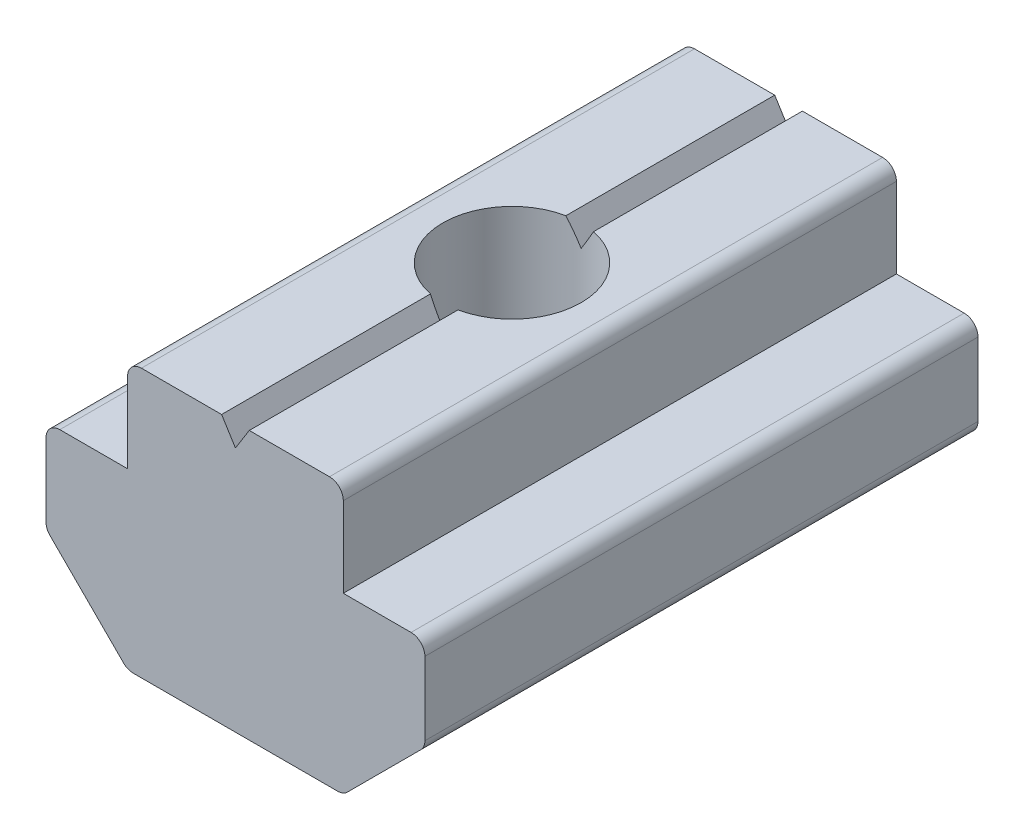
ISO-10303-21;
HEADER;
FILE_DESCRIPTION(('STEP AP214'),'2;1');
FILE_NAME('part.step','',(''),(''),'','','');
FILE_SCHEMA(('AUTOMOTIVE_DESIGN { 1 0 10303 214 1 1 1 1 }'));
ENDSEC;
DATA;
#1=APPLICATION_CONTEXT('core data for automotive mechanical design processes');
#2=APPLICATION_PROTOCOL_DEFINITION('international standard','automotive_design',2000,#1);
#3=PRODUCT_CONTEXT('',#1,'mechanical');
#4=PRODUCT('Part','Part','',(#3));
#5=PRODUCT_RELATED_PRODUCT_CATEGORY('part','',(#4));
#6=PRODUCT_DEFINITION_FORMATION('','',#4);
#7=PRODUCT_DEFINITION_CONTEXT('part definition',#1,'design');
#8=PRODUCT_DEFINITION('design','',#6,#7);
#9=PRODUCT_DEFINITION_SHAPE('','',#8);
#10=(LENGTH_UNIT() NAMED_UNIT(*) SI_UNIT(.MILLI.,.METRE.));
#11=(NAMED_UNIT(*) PLANE_ANGLE_UNIT() SI_UNIT($,.RADIAN.));
#12=(NAMED_UNIT(*) SI_UNIT($,.STERADIAN.) SOLID_ANGLE_UNIT());
#13=UNCERTAINTY_MEASURE_WITH_UNIT(LENGTH_MEASURE(1.E-05),#10,'distance_accuracy_value','');
#14=(GEOMETRIC_REPRESENTATION_CONTEXT(3) GLOBAL_UNCERTAINTY_ASSIGNED_CONTEXT((#13)) GLOBAL_UNIT_ASSIGNED_CONTEXT((#10,
#11,#12)) REPRESENTATION_CONTEXT('',''));
#15=CARTESIAN_POINT('',(0.,0.,0.));
#16=DIRECTION('',(0.,0.,1.));
#17=DIRECTION('',(1.,0.,0.));
#18=AXIS2_PLACEMENT_3D('',#15,#16,#17);
#19=CARTESIAN_POINT('',(3.88423493499598,8.9000000000002,10.));
#20=DIRECTION('',(0.847998304005041,-0.529998940003256,0.));
#21=DIRECTION('',(0.529998940003256,0.847998304005041,0.));
#22=AXIS2_PLACEMENT_3D('',#19,#20,#21);
#23=PLANE('',#22);
#24=DIRECTION('',(0.,0.,-1.));
#25=VECTOR('',#24,1.);
#26=CARTESIAN_POINT('',(3.88423493499598,8.9000000000002,10.));
#27=LINE('',#26,#25);
#28=CARTESIAN_POINT('',(3.88423493499598,8.9000000000002,-2.49999999999999));
#29=VERTEX_POINT('',#28);
#30=CARTESIAN_POINT('',(3.88423493499598,8.9000000000002,-10.));
#31=VERTEX_POINT('',#30);
#32=EDGE_CURVE('E288',#29,#31,#27,.T.);
#33=ORIENTED_EDGE('',*,*,#32,.F.);
#34=CARTESIAN_POINT('',(3.88423493499598,8.9000000000002,0.));
#35=DIRECTION('',(0.847998304005041,-0.529998940003256,0.));
#36=DIRECTION('',(-0.529998940003256,-0.847998304005041,0.));
#37=AXIS2_PLACEMENT_3D('',#34,#35,#36);
#38=ELLIPSE('',#37,4.71699056602762,2.5);
#39=CARTESIAN_POINT('',(4.38423493499598,9.70000000000005,-2.44948974278317));
#40=VERTEX_POINT('',#39);
#41=EDGE_CURVE('E389',#29,#40,#38,.T.);
#42=ORIENTED_EDGE('',*,*,#41,.T.);
#43=DIRECTION('',(0.,0.,-1.));
#44=VECTOR('',#43,1.);
#45=CARTESIAN_POINT('',(4.38423493499598,9.70000000000005,10.));
#46=LINE('',#45,#44);
#47=CARTESIAN_POINT('',(4.38423493499598,9.70000000000005,-10.));
#48=VERTEX_POINT('',#47);
#49=EDGE_CURVE('E292',#40,#48,#46,.T.);
#50=ORIENTED_EDGE('',*,*,#49,.T.);
#51=DIRECTION('',(-0.529998940003256,-0.847998304005041,0.));
#52=VECTOR('',#51,1.);
#53=CARTESIAN_POINT('',(3.88423493499598,8.9000000000002,-10.));
#54=LINE('',#53,#52);
#55=EDGE_CURVE('E248',#48,#31,#54,.T.);
#56=ORIENTED_EDGE('',*,*,#55,.T.);
#57=EDGE_LOOP('',(#33,#42,#50,#56));
#58=FACE_BOUND('',#57,.T.);
#59=ADVANCED_FACE('F37',(#58),#23,.F.);
#60=CARTESIAN_POINT('',(3.88423493499598,8.9000000000002,10.));
#61=DIRECTION('',(-0.84799830400504,-0.529998940003256,0.));
#62=DIRECTION('',(0.529998940003256,-0.84799830400504,0.));
#63=AXIS2_PLACEMENT_3D('',#60,#61,#62);
#64=PLANE('',#63);
#65=CARTESIAN_POINT('',(3.88423493499598,8.9000000000002,10.));
#66=VERTEX_POINT('',#65);
#67=CARTESIAN_POINT('',(3.88423493499598,8.9000000000002,2.5));
#68=VERTEX_POINT('',#67);
#69=EDGE_CURVE('E289',#66,#68,#27,.T.);
#70=ORIENTED_EDGE('',*,*,#69,.T.);
#71=CARTESIAN_POINT('',(3.88423493499598,8.90000000000021,0.));
#72=DIRECTION('',(-0.84799830400504,-0.529998940003256,0.));
#73=DIRECTION('',(0.529998940003256,-0.847998304005041,0.));
#74=AXIS2_PLACEMENT_3D('',#71,#72,#73);
#75=ELLIPSE('',#74,4.71699056602762,2.5);
#76=CARTESIAN_POINT('',(3.38423493499598,9.70000000000005,2.44948974278317));
#77=VERTEX_POINT('',#76);
#78=EDGE_CURVE('E393',#68,#77,#75,.T.);
#79=ORIENTED_EDGE('',*,*,#78,.T.);
#80=DIRECTION('',(0.,0.,-1.));
#81=VECTOR('',#80,1.);
#82=CARTESIAN_POINT('',(3.38423493499598,9.70000000000005,10.));
#83=LINE('',#82,#81);
#84=CARTESIAN_POINT('',(3.38423493499598,9.70000000000005,10.));
#85=VERTEX_POINT('',#84);
#86=EDGE_CURVE('E285',#85,#77,#83,.T.);
#87=ORIENTED_EDGE('',*,*,#86,.F.);
#88=DIRECTION('',(-0.529998940003256,0.84799830400504,0.));
#89=VECTOR('',#88,1.);
#90=CARTESIAN_POINT('',(3.88423493499598,8.9000000000002,10.));
#91=LINE('',#90,#89);
#92=EDGE_CURVE('E361',#66,#85,#91,.T.);
#93=ORIENTED_EDGE('',*,*,#92,.F.);
#94=EDGE_LOOP('',(#70,#79,#87,#93));
#95=FACE_BOUND('',#94,.T.);
#96=ADVANCED_FACE('F410',(#95),#64,.F.);
#97=CARTESIAN_POINT('',(0.19134171618256,0.500000000000114,10.));
#98=DIRECTION('',(0.,0.,-1.));
#99=DIRECTION('',(-1.,0.,0.));
#100=AXIS2_PLACEMENT_3D('',#97,#98,#99);
#101=CYLINDRICAL_SURFACE('',#100,0.50000000000014);
#102=CARTESIAN_POINT('',(0.19134171618256,0.500000000000114,-10.));
#103=DIRECTION('',(0.,0.,1.));
#104=DIRECTION('',(1.,0.,0.));
#105=AXIS2_PLACEMENT_3D('',#102,#103,#104);
#106=CIRCLE('',#105,0.50000000000014);
#107=CARTESIAN_POINT('',(-0.162211674410773,0.146446609406666,-10.));
#108=VERTEX_POINT('',#107);
#109=CARTESIAN_POINT('',(0.19134171618256,0.,-10.));
#110=VERTEX_POINT('',#109);
#111=EDGE_CURVE('E223',#108,#110,#106,.T.);
#112=ORIENTED_EDGE('',*,*,#111,.T.);
#113=DIRECTION('',(0.,0.,-1.));
#114=VECTOR('',#113,1.);
#115=CARTESIAN_POINT('',(0.19134171618256,0.,10.));
#116=LINE('',#115,#114);
#117=CARTESIAN_POINT('',(0.19134171618256,0.,10.));
#118=VERTEX_POINT('',#117);
#119=EDGE_CURVE('E11',#118,#110,#116,.T.);
#120=ORIENTED_EDGE('',*,*,#119,.F.);
#121=CARTESIAN_POINT('',(0.19134171618256,0.500000000000114,10.));
#122=DIRECTION('',(0.,0.,1.));
#123=DIRECTION('',(1.,0.,0.));
#124=AXIS2_PLACEMENT_3D('',#121,#122,#123);
#125=CIRCLE('',#124,0.50000000000014);
#126=CARTESIAN_POINT('',(-0.162211674410773,0.146446609406666,10.));
#127=VERTEX_POINT('',#126);
#128=EDGE_CURVE('E268',#127,#118,#125,.T.);
#129=ORIENTED_EDGE('',*,*,#128,.F.);
#130=DIRECTION('',(0.,0.,-1.));
#131=VECTOR('',#130,1.);
#132=CARTESIAN_POINT('',(-0.162211674410773,0.146446609406666,10.));
#133=LINE('',#132,#131);
#134=EDGE_CURVE('E219',#127,#108,#133,.T.);
#135=ORIENTED_EDGE('',*,*,#134,.T.);
#136=EDGE_LOOP('',(#112,#120,#129,#135));
#137=FACE_BOUND('',#136,.T.);
#138=ADVANCED_FACE('F39',(#137),#101,.T.);
#139=CARTESIAN_POINT('',(7.57712815380941,0.,10.));
#140=DIRECTION('',(0.,1.,0.));
#141=DIRECTION('',(-1.,0.,0.));
#142=AXIS2_PLACEMENT_3D('',#139,#140,#141);
#143=PLANE('',#142);
#144=CARTESIAN_POINT('',(3.88423493499598,0.,0.));
#145=DIRECTION('',(0.,-1.,0.));
#146=DIRECTION('',(0.,0.,-1.));
#147=AXIS2_PLACEMENT_3D('',#144,#145,#146);
#148=CIRCLE('',#147,2.5);
#149=CARTESIAN_POINT('',(3.88423493499598,0.,-2.5));
#150=VERTEX_POINT('',#149);
#151=EDGE_CURVE('E397',#150,#150,#148,.T.);
#152=ORIENTED_EDGE('',*,*,#151,.F.);
#153=EDGE_LOOP('',(#152));
#154=FACE_BOUND('',#153,.T.);
#155=DIRECTION('',(1.,0.,0.));
#156=VECTOR('',#155,1.);
#157=CARTESIAN_POINT('',(7.57712815380941,0.,-10.));
#158=LINE('',#157,#156);
#159=CARTESIAN_POINT('',(7.57712815380941,0.,-10.));
#160=VERTEX_POINT('',#159);
#161=EDGE_CURVE('E226',#110,#160,#158,.T.);
#162=ORIENTED_EDGE('',*,*,#161,.T.);
#163=DIRECTION('',(0.,0.,-1.));
#164=VECTOR('',#163,1.);
#165=CARTESIAN_POINT('',(7.57712815380941,0.,10.));
#166=LINE('',#165,#164);
#167=CARTESIAN_POINT('',(7.57712815380941,0.,10.));
#168=VERTEX_POINT('',#167);
#169=EDGE_CURVE('E45',#168,#160,#166,.T.);
#170=ORIENTED_EDGE('',*,*,#169,.F.);
#171=DIRECTION('',(1.,0.,0.));
#172=VECTOR('',#171,1.);
#173=CARTESIAN_POINT('',(7.57712815380941,0.,10.));
#174=LINE('',#173,#172);
#175=EDGE_CURVE('E141',#118,#168,#174,.T.);
#176=ORIENTED_EDGE('',*,*,#175,.F.);
#177=ORIENTED_EDGE('',*,*,#119,.T.);
#178=EDGE_LOOP('',(#162,#170,#176,#177));
#179=FACE_BOUND('',#178,.T.);
#180=ADVANCED_FACE('F403',(#154,#179),#143,.F.);
#181=CARTESIAN_POINT('',(7.57712815380941,0.500000000000228,10.));
#182=DIRECTION('',(0.,0.,-1.));
#183=DIRECTION('',(-1.,0.,0.));
#184=AXIS2_PLACEMENT_3D('',#181,#182,#183);
#185=CYLINDRICAL_SURFACE('',#184,0.500000000000165);
#186=CARTESIAN_POINT('',(7.57712815380941,0.500000000000228,-10.));
#187=DIRECTION('',(0.,0.,1.));
#188=DIRECTION('',(1.,0.,0.));
#189=AXIS2_PLACEMENT_3D('',#186,#187,#188);
#190=CIRCLE('',#189,0.500000000000165);
#191=CARTESIAN_POINT('',(7.93068154440274,0.14644660940678,-10.));
#192=VERTEX_POINT('',#191);
#193=EDGE_CURVE('E229',#160,#192,#190,.T.);
#194=ORIENTED_EDGE('',*,*,#193,.T.);
#195=DIRECTION('',(0.,0.,-1.));
#196=VECTOR('',#195,1.);
#197=CARTESIAN_POINT('',(7.93068154440274,0.14644660940678,10.));
#198=LINE('',#197,#196);
#199=CARTESIAN_POINT('',(7.93068154440274,0.14644660940678,10.));
#200=VERTEX_POINT('',#199);
#201=EDGE_CURVE('E317',#200,#192,#198,.T.);
#202=ORIENTED_EDGE('',*,*,#201,.F.);
#203=CARTESIAN_POINT('',(7.57712815380941,0.500000000000228,10.));
#204=DIRECTION('',(0.,0.,1.));
#205=DIRECTION('',(1.,0.,0.));
#206=AXIS2_PLACEMENT_3D('',#203,#204,#205);
#207=CIRCLE('',#206,0.500000000000165);
#208=EDGE_CURVE('E325',#168,#200,#207,.T.);
#209=ORIENTED_EDGE('',*,*,#208,.F.);
#210=ORIENTED_EDGE('',*,*,#169,.T.);
#211=EDGE_LOOP('',(#194,#202,#209,#210));
#212=FACE_BOUND('',#211,.T.);
#213=ADVANCED_FACE('F323',(#212),#185,.T.);
#214=CARTESIAN_POINT('',(10.5877883255897,2.8035533905935,10.));
#215=DIRECTION('',(-0.707106781186518,0.707106781186577,0.));
#216=DIRECTION('',(-0.707106781186577,-0.707106781186518,0.));
#217=AXIS2_PLACEMENT_3D('',#214,#215,#216);
#218=PLANE('',#217);
#219=DIRECTION('',(0.707106781186577,0.707106781186518,0.));
#220=VECTOR('',#219,1.);
#221=CARTESIAN_POINT('',(10.5877883255897,2.8035533905935,-10.));
#222=LINE('',#221,#220);
#223=CARTESIAN_POINT('',(10.5877883255897,2.8035533905935,-10.));
#224=VERTEX_POINT('',#223);
#225=EDGE_CURVE('E231',#192,#224,#222,.T.);
#226=ORIENTED_EDGE('',*,*,#225,.T.);
#227=DIRECTION('',(0.,0.,-1.));
#228=VECTOR('',#227,1.);
#229=CARTESIAN_POINT('',(10.5877883255897,2.8035533905935,10.));
#230=LINE('',#229,#228);
#231=CARTESIAN_POINT('',(10.5877883255897,2.8035533905935,10.));
#232=VERTEX_POINT('',#231);
#233=EDGE_CURVE('E314',#232,#224,#230,.T.);
#234=ORIENTED_EDGE('',*,*,#233,.F.);
#235=DIRECTION('',(0.707106781186577,0.707106781186518,0.));
#236=VECTOR('',#235,1.);
#237=CARTESIAN_POINT('',(10.5877883255897,2.8035533905935,10.));
#238=LINE('',#237,#236);
#239=EDGE_CURVE('E343',#200,#232,#238,.T.);
#240=ORIENTED_EDGE('',*,*,#239,.F.);
#241=ORIENTED_EDGE('',*,*,#201,.T.);
#242=EDGE_LOOP('',(#226,#234,#240,#241));
#243=FACE_BOUND('',#242,.T.);
#244=ADVANCED_FACE('F334',(#243),#218,.F.);
#245=CARTESIAN_POINT('',(10.2342349349963,3.15710678118671,10.));
#246=DIRECTION('',(0.,0.,-1.));
#247=DIRECTION('',(-1.,0.,0.));
#248=AXIS2_PLACEMENT_3D('',#245,#246,#247);
#249=CYLINDRICAL_SURFACE('',#248,0.5);
#250=CARTESIAN_POINT('',(10.2342349349963,3.15710678118671,-10.));
#251=DIRECTION('',(0.,0.,1.));
#252=DIRECTION('',(1.,0.,0.));
#253=AXIS2_PLACEMENT_3D('',#250,#251,#252);
#254=CIRCLE('',#253,0.5);
#255=CARTESIAN_POINT('',(10.7342349349963,3.15710678118671,-10.));
#256=VERTEX_POINT('',#255);
#257=EDGE_CURVE('E233',#224,#256,#254,.T.);
#258=ORIENTED_EDGE('',*,*,#257,.T.);
#259=DIRECTION('',(0.,0.,-1.));
#260=VECTOR('',#259,1.);
#261=CARTESIAN_POINT('',(10.7342349349963,3.15710678118671,10.));
#262=LINE('',#261,#260);
#263=CARTESIAN_POINT('',(10.7342349349963,3.15710678118671,10.));
#264=VERTEX_POINT('',#263);
#265=EDGE_CURVE('E311',#264,#256,#262,.T.);
#266=ORIENTED_EDGE('',*,*,#265,.F.);
#267=CARTESIAN_POINT('',(10.2342349349963,3.15710678118671,10.));
#268=DIRECTION('',(0.,0.,1.));
#269=DIRECTION('',(1.,0.,0.));
#270=AXIS2_PLACEMENT_3D('',#267,#268,#269);
#271=CIRCLE('',#270,0.5);
#272=EDGE_CURVE('E340',#232,#264,#271,.T.);
#273=ORIENTED_EDGE('',*,*,#272,.F.);
#274=ORIENTED_EDGE('',*,*,#233,.T.);
#275=EDGE_LOOP('',(#258,#266,#273,#274));
#276=FACE_BOUND('',#275,.T.);
#277=ADVANCED_FACE('F338',(#276),#249,.T.);
#278=CARTESIAN_POINT('',(10.7342349349959,5.8000000000003,10.));
#279=DIRECTION('',(-1.,-1.71969698764429E-13,0.));
#280=DIRECTION('',(1.71969698764429E-13,-1.,0.));
#281=AXIS2_PLACEMENT_3D('',#278,#279,#280);
#282=PLANE('',#281);
#283=DIRECTION('',(-1.71969698764429E-13,1.,0.));
#284=VECTOR('',#283,1.);
#285=CARTESIAN_POINT('',(10.7342349349959,5.8000000000003,-10.));
#286=LINE('',#285,#284);
#287=CARTESIAN_POINT('',(10.7342349349959,5.8000000000003,-10.));
#288=VERTEX_POINT('',#287);
#289=EDGE_CURVE('E235',#256,#288,#286,.T.);
#290=ORIENTED_EDGE('',*,*,#289,.T.);
#291=DIRECTION('',(0.,0.,-1.));
#292=VECTOR('',#291,1.);
#293=CARTESIAN_POINT('',(10.7342349349959,5.8000000000003,10.));
#294=LINE('',#293,#292);
#295=CARTESIAN_POINT('',(10.7342349349959,5.8000000000003,10.));
#296=VERTEX_POINT('',#295);
#297=EDGE_CURVE('E308',#296,#288,#294,.T.);
#298=ORIENTED_EDGE('',*,*,#297,.F.);
#299=DIRECTION('',(-1.71969698764429E-13,1.,0.));
#300=VECTOR('',#299,1.);
#301=CARTESIAN_POINT('',(10.7342349349959,5.8000000000003,10.));
#302=LINE('',#301,#300);
#303=EDGE_CURVE('E342',#264,#296,#302,.T.);
#304=ORIENTED_EDGE('',*,*,#303,.F.);
#305=ORIENTED_EDGE('',*,*,#265,.T.);
#306=EDGE_LOOP('',(#290,#298,#304,#305));
#307=FACE_BOUND('',#306,.T.);
#308=ADVANCED_FACE('F618',(#307),#282,.F.);
#309=CARTESIAN_POINT('',(10.2342349349959,5.8000000000003,10.));
#310=DIRECTION('',(0.,0.,-1.));
#311=DIRECTION('',(-1.,0.,0.));
#312=AXIS2_PLACEMENT_3D('',#309,#310,#311);
#313=CYLINDRICAL_SURFACE('',#312,0.5);
#314=CARTESIAN_POINT('',(10.2342349349959,5.8000000000003,-10.));
#315=DIRECTION('',(0.,0.,1.));
#316=DIRECTION('',(1.,0.,0.));
#317=AXIS2_PLACEMENT_3D('',#314,#315,#316);
#318=CIRCLE('',#317,0.5);
#319=CARTESIAN_POINT('',(10.2342349349959,6.3000000000003,-10.));
#320=VERTEX_POINT('',#319);
#321=EDGE_CURVE('E237',#288,#320,#318,.T.);
#322=ORIENTED_EDGE('',*,*,#321,.T.);
#323=DIRECTION('',(0.,0.,-1.));
#324=VECTOR('',#323,1.);
#325=CARTESIAN_POINT('',(10.2342349349959,6.3000000000003,10.));
#326=LINE('',#325,#324);
#327=CARTESIAN_POINT('',(10.2342349349959,6.3000000000003,10.));
#328=VERTEX_POINT('',#327);
#329=EDGE_CURVE('E305',#328,#320,#326,.T.);
#330=ORIENTED_EDGE('',*,*,#329,.F.);
#331=CARTESIAN_POINT('',(10.2342349349959,5.8000000000003,10.));
#332=DIRECTION('',(0.,0.,1.));
#333=DIRECTION('',(1.,0.,0.));
#334=AXIS2_PLACEMENT_3D('',#331,#332,#333);
#335=CIRCLE('',#334,0.5);
#336=EDGE_CURVE('E345',#296,#328,#335,.T.);
#337=ORIENTED_EDGE('',*,*,#336,.F.);
#338=ORIENTED_EDGE('',*,*,#297,.T.);
#339=EDGE_LOOP('',(#322,#330,#337,#338));
#340=FACE_BOUND('',#339,.T.);
#341=ADVANCED_FACE('F610',(#340),#313,.T.);
#342=CARTESIAN_POINT('',(7.78423493499653,6.3000000000003,10.));
#343=DIRECTION('',(0.,-1.,0.));
#344=DIRECTION('',(0.,0.,-1.));
#345=AXIS2_PLACEMENT_3D('',#342,#343,#344);
#346=PLANE('',#345);
#347=DIRECTION('',(-1.,0.,0.));
#348=VECTOR('',#347,1.);
#349=CARTESIAN_POINT('',(7.78423493499653,6.3000000000003,-10.));
#350=LINE('',#349,#348);
#351=CARTESIAN_POINT('',(7.78423493499653,6.3000000000003,-10.));
#352=VERTEX_POINT('',#351);
#353=EDGE_CURVE('E239',#320,#352,#350,.T.);
#354=ORIENTED_EDGE('',*,*,#353,.T.);
#355=DIRECTION('',(0.,0.,-1.));
#356=VECTOR('',#355,1.);
#357=CARTESIAN_POINT('',(7.78423493499653,6.3000000000003,10.));
#358=LINE('',#357,#356);
#359=CARTESIAN_POINT('',(7.78423493499653,6.3000000000003,10.));
#360=VERTEX_POINT('',#359);
#361=EDGE_CURVE('E302',#360,#352,#358,.T.);
#362=ORIENTED_EDGE('',*,*,#361,.F.);
#363=DIRECTION('',(-1.,0.,0.));
#364=VECTOR('',#363,1.);
#365=CARTESIAN_POINT('',(7.78423493499653,6.3000000000003,10.));
#366=LINE('',#365,#364);
#367=EDGE_CURVE('E351',#328,#360,#366,.T.);
#368=ORIENTED_EDGE('',*,*,#367,.F.);
#369=ORIENTED_EDGE('',*,*,#329,.T.);
#370=EDGE_LOOP('',(#354,#362,#368,#369));
#371=FACE_BOUND('',#370,.T.);
#372=ADVANCED_FACE('F602',(#371),#346,.F.);
#373=CARTESIAN_POINT('',(7.78423493499607,9.20000000000016,10.));
#374=DIRECTION('',(-1.,-1.57321473855835E-13,0.));
#375=DIRECTION('',(1.57321473855835E-13,-1.,0.));
#376=AXIS2_PLACEMENT_3D('',#373,#374,#375);
#377=PLANE('',#376);
#378=DIRECTION('',(-1.57321473855835E-13,1.,0.));
#379=VECTOR('',#378,1.);
#380=CARTESIAN_POINT('',(7.78423493499607,9.20000000000016,-10.));
#381=LINE('',#380,#379);
#382=CARTESIAN_POINT('',(7.78423493499608,9.20000000000016,-10.));
#383=VERTEX_POINT('',#382);
#384=EDGE_CURVE('E241',#352,#383,#381,.T.);
#385=ORIENTED_EDGE('',*,*,#384,.T.);
#386=DIRECTION('',(0.,0.,-1.));
#387=VECTOR('',#386,1.);
#388=CARTESIAN_POINT('',(7.78423493499608,9.20000000000016,10.));
#389=LINE('',#388,#387);
#390=CARTESIAN_POINT('',(7.78423493499608,9.20000000000016,10.));
#391=VERTEX_POINT('',#390);
#392=EDGE_CURVE('E299',#391,#383,#389,.T.);
#393=ORIENTED_EDGE('',*,*,#392,.F.);
#394=DIRECTION('',(-1.57321473855835E-13,1.,0.));
#395=VECTOR('',#394,1.);
#396=CARTESIAN_POINT('',(7.78423493499607,9.20000000000016,10.));
#397=LINE('',#396,#395);
#398=EDGE_CURVE('E353',#360,#391,#397,.T.);
#399=ORIENTED_EDGE('',*,*,#398,.F.);
#400=ORIENTED_EDGE('',*,*,#361,.T.);
#401=EDGE_LOOP('',(#385,#393,#399,#400));
#402=FACE_BOUND('',#401,.T.);
#403=ADVANCED_FACE('F598',(#402),#377,.F.);
#404=CARTESIAN_POINT('',(7.28423493499608,9.20000000000016,10.));
#405=DIRECTION('',(0.,0.,-1.));
#406=DIRECTION('',(-1.,0.,0.));
#407=AXIS2_PLACEMENT_3D('',#404,#405,#406);
#408=CYLINDRICAL_SURFACE('',#407,0.5);
#409=CARTESIAN_POINT('',(7.28423493499608,9.20000000000016,-10.));
#410=DIRECTION('',(0.,0.,1.));
#411=DIRECTION('',(1.,0.,0.));
#412=AXIS2_PLACEMENT_3D('',#409,#410,#411);
#413=CIRCLE('',#412,0.5);
#414=CARTESIAN_POINT('',(7.28423493499608,9.70000000000016,-10.));
#415=VERTEX_POINT('',#414);
#416=EDGE_CURVE('E243',#383,#415,#413,.T.);
#417=ORIENTED_EDGE('',*,*,#416,.T.);
#418=DIRECTION('',(0.,0.,-1.));
#419=VECTOR('',#418,1.);
#420=CARTESIAN_POINT('',(7.28423493499608,9.70000000000016,10.));
#421=LINE('',#420,#419);
#422=CARTESIAN_POINT('',(7.28423493499608,9.70000000000016,10.));
#423=VERTEX_POINT('',#422);
#424=EDGE_CURVE('E296',#423,#415,#421,.T.);
#425=ORIENTED_EDGE('',*,*,#424,.F.);
#426=CARTESIAN_POINT('',(7.28423493499608,9.20000000000016,10.));
#427=DIRECTION('',(0.,0.,1.));
#428=DIRECTION('',(1.,0.,0.));
#429=AXIS2_PLACEMENT_3D('',#426,#427,#428);
#430=CIRCLE('',#429,0.5);
#431=EDGE_CURVE('E355',#391,#423,#430,.T.);
#432=ORIENTED_EDGE('',*,*,#431,.F.);
#433=ORIENTED_EDGE('',*,*,#392,.T.);
#434=EDGE_LOOP('',(#417,#425,#432,#433));
#435=FACE_BOUND('',#434,.T.);
#436=ADVANCED_FACE('F432',(#435),#408,.T.);
#437=CARTESIAN_POINT('',(4.38423493499598,9.70000000000005,10.));
#438=DIRECTION('',(0.,-1.,0.));
#439=DIRECTION('',(1.,0.,0.));
#440=AXIS2_PLACEMENT_3D('',#437,#438,#439);
#441=PLANE('',#440);
#442=ORIENTED_EDGE('',*,*,#49,.F.);
#443=CARTESIAN_POINT('',(3.88423493499598,9.70000000000003,0.));
#444=DIRECTION('',(0.,-1.,0.));
#445=DIRECTION('',(1.,0.,0.));
#446=AXIS2_PLACEMENT_3D('',#443,#444,#445);
#447=CIRCLE('',#446,2.5);
#448=CARTESIAN_POINT('',(4.38423493499598,9.70000000000005,2.44948974278317));
#449=VERTEX_POINT('',#448);
#450=EDGE_CURVE('E227',#40,#449,#447,.T.);
#451=ORIENTED_EDGE('',*,*,#450,.T.);
#452=CARTESIAN_POINT('',(4.38423493499598,9.70000000000005,10.));
#453=VERTEX_POINT('',#452);
#454=EDGE_CURVE('E293',#453,#449,#46,.T.);
#455=ORIENTED_EDGE('',*,*,#454,.F.);
#456=DIRECTION('',(-1.,0.,0.));
#457=VECTOR('',#456,1.);
#458=CARTESIAN_POINT('',(4.38423493499598,9.70000000000005,10.));
#459=LINE('',#458,#457);
#460=EDGE_CURVE('E357',#423,#453,#459,.T.);
#461=ORIENTED_EDGE('',*,*,#460,.F.);
#462=ORIENTED_EDGE('',*,*,#424,.T.);
#463=DIRECTION('',(-1.,0.,0.));
#464=VECTOR('',#463,1.);
#465=CARTESIAN_POINT('',(4.38423493499598,9.70000000000005,-10.));
#466=LINE('',#465,#464);
#467=EDGE_CURVE('E245',#415,#48,#466,.T.);
#468=ORIENTED_EDGE('',*,*,#467,.T.);
#469=EDGE_LOOP('',(#442,#451,#455,#461,#462,#468));
#470=FACE_BOUND('',#469,.T.);
#471=ADVANCED_FACE('F424',(#470),#441,.F.);
#472=ORIENTED_EDGE('',*,*,#454,.T.);
#473=EDGE_CURVE('E390',#449,#68,#38,.T.);
#474=ORIENTED_EDGE('',*,*,#473,.T.);
#475=ORIENTED_EDGE('',*,*,#69,.F.);
#476=DIRECTION('',(-0.529998940003256,-0.847998304005041,0.));
#477=VECTOR('',#476,1.);
#478=CARTESIAN_POINT('',(3.88423493499598,8.9000000000002,10.));
#479=LINE('',#478,#477);
#480=EDGE_CURVE('E359',#453,#66,#479,.T.);
#481=ORIENTED_EDGE('',*,*,#480,.F.);
#482=EDGE_LOOP('',(#472,#474,#475,#481));
#483=FACE_BOUND('',#482,.T.);
#484=ADVANCED_FACE('F414',(#483),#23,.F.);
#485=CARTESIAN_POINT('',(3.38423493499598,9.70000000000005,-2.44948974278317));
#486=VERTEX_POINT('',#485);
#487=CARTESIAN_POINT('',(3.38423493499598,9.70000000000005,-10.));
#488=VERTEX_POINT('',#487);
#489=EDGE_CURVE('E284',#486,#488,#83,.T.);
#490=ORIENTED_EDGE('',*,*,#489,.F.);
#491=EDGE_CURVE('E52',#486,#29,#75,.T.);
#492=ORIENTED_EDGE('',*,*,#491,.T.);
#493=ORIENTED_EDGE('',*,*,#32,.T.);
#494=DIRECTION('',(-0.529998940003256,0.84799830400504,0.));
#495=VECTOR('',#494,1.);
#496=CARTESIAN_POINT('',(3.88423493499598,8.9000000000002,-10.));
#497=LINE('',#496,#495);
#498=EDGE_CURVE('E251',#31,#488,#497,.T.);
#499=ORIENTED_EDGE('',*,*,#498,.T.);
#500=EDGE_LOOP('',(#490,#492,#493,#499));
#501=FACE_BOUND('',#500,.T.);
#502=ADVANCED_FACE('F420',(#501),#64,.F.);
#503=CARTESIAN_POINT('',(0.484234934995893,9.70000000000016,10.));
#504=DIRECTION('',(0.,-1.,0.));
#505=DIRECTION('',(1.,0.,0.));
#506=AXIS2_PLACEMENT_3D('',#503,#504,#505);
#507=PLANE('',#506);
#508=ORIENTED_EDGE('',*,*,#86,.T.);
#509=CARTESIAN_POINT('',(3.88423493499598,9.70000000000003,0.));
#510=DIRECTION('',(0.,-1.,0.));
#511=DIRECTION('',(1.,0.,0.));
#512=AXIS2_PLACEMENT_3D('',#509,#510,#511);
#513=CIRCLE('',#512,2.5);
#514=EDGE_CURVE('E395',#77,#486,#513,.T.);
#515=ORIENTED_EDGE('',*,*,#514,.T.);
#516=ORIENTED_EDGE('',*,*,#489,.T.);
#517=DIRECTION('',(-1.,0.,0.));
#518=VECTOR('',#517,1.);
#519=CARTESIAN_POINT('',(0.484234934995893,9.70000000000016,-10.));
#520=LINE('',#519,#518);
#521=CARTESIAN_POINT('',(0.484234934995893,9.70000000000016,-10.));
#522=VERTEX_POINT('',#521);
#523=EDGE_CURVE('E254',#488,#522,#520,.T.);
#524=ORIENTED_EDGE('',*,*,#523,.T.);
#525=DIRECTION('',(0.,0.,-1.));
#526=VECTOR('',#525,1.);
#527=CARTESIAN_POINT('',(0.484234934995893,9.70000000000016,10.));
#528=LINE('',#527,#526);
#529=CARTESIAN_POINT('',(0.484234934995893,9.70000000000016,10.));
#530=VERTEX_POINT('',#529);
#531=EDGE_CURVE('E281',#530,#522,#528,.T.);
#532=ORIENTED_EDGE('',*,*,#531,.F.);
#533=DIRECTION('',(-1.,0.,0.));
#534=VECTOR('',#533,1.);
#535=CARTESIAN_POINT('',(0.484234934995893,9.70000000000016,10.));
#536=LINE('',#535,#534);
#537=EDGE_CURVE('E363',#85,#530,#536,.T.);
#538=ORIENTED_EDGE('',*,*,#537,.F.);
#539=EDGE_LOOP('',(#508,#515,#516,#524,#532,#538));
#540=FACE_BOUND('',#539,.T.);
#541=ADVANCED_FACE('F430',(#540),#507,.F.);
#542=CARTESIAN_POINT('',(0.484234934995893,9.20000000000016,10.));
#543=DIRECTION('',(0.,0.,-1.));
#544=DIRECTION('',(-1.,0.,0.));
#545=AXIS2_PLACEMENT_3D('',#542,#543,#544);
#546=CYLINDRICAL_SURFACE('',#545,0.5);
#547=CARTESIAN_POINT('',(0.484234934995893,9.20000000000016,-10.));
#548=DIRECTION('',(0.,0.,1.));
#549=DIRECTION('',(1.,0.,0.));
#550=AXIS2_PLACEMENT_3D('',#547,#548,#549);
#551=CIRCLE('',#550,0.5);
#552=CARTESIAN_POINT('',(-0.0157650650041067,9.20000000000016,-10.));
#553=VERTEX_POINT('',#552);
#554=EDGE_CURVE('E256',#522,#553,#551,.T.);
#555=ORIENTED_EDGE('',*,*,#554,.T.);
#556=DIRECTION('',(0.,0.,-1.));
#557=VECTOR('',#556,1.);
#558=CARTESIAN_POINT('',(-0.0157650650041067,9.20000000000016,10.));
#559=LINE('',#558,#557);
#560=CARTESIAN_POINT('',(-0.0157650650041067,9.20000000000016,10.));
#561=VERTEX_POINT('',#560);
#562=EDGE_CURVE('E278',#561,#553,#559,.T.);
#563=ORIENTED_EDGE('',*,*,#562,.F.);
#564=CARTESIAN_POINT('',(0.484234934995893,9.20000000000016,10.));
#565=DIRECTION('',(0.,0.,1.));
#566=DIRECTION('',(1.,0.,0.));
#567=AXIS2_PLACEMENT_3D('',#564,#565,#566);
#568=CIRCLE('',#567,0.5);
#569=EDGE_CURVE('E365',#530,#561,#568,.T.);
#570=ORIENTED_EDGE('',*,*,#569,.F.);
#571=ORIENTED_EDGE('',*,*,#531,.T.);
#572=EDGE_LOOP('',(#555,#563,#570,#571));
#573=FACE_BOUND('',#572,.T.);
#574=ADVANCED_FACE('F472',(#573),#546,.T.);
#575=CARTESIAN_POINT('',(-0.0157650650045612,6.30000000000018,10.));
#576=DIRECTION('',(1.,-1.56723293346871E-13,0.));
#577=DIRECTION('',(1.56723293346871E-13,1.,0.));
#578=AXIS2_PLACEMENT_3D('',#575,#576,#577);
#579=PLANE('',#578);
#580=DIRECTION('',(-1.56723293346871E-13,-1.,0.));
#581=VECTOR('',#580,1.);
#582=CARTESIAN_POINT('',(-0.0157650650045612,6.30000000000018,-10.));
#583=LINE('',#582,#581);
#584=CARTESIAN_POINT('',(-0.0157650650045612,6.30000000000018,-10.));
#585=VERTEX_POINT('',#584);
#586=EDGE_CURVE('E258',#553,#585,#583,.T.);
#587=ORIENTED_EDGE('',*,*,#586,.T.);
#588=DIRECTION('',(0.,0.,-1.));
#589=VECTOR('',#588,1.);
#590=CARTESIAN_POINT('',(-0.0157650650045612,6.30000000000018,10.));
#591=LINE('',#590,#589);
#592=CARTESIAN_POINT('',(-0.0157650650045612,6.30000000000018,10.));
#593=VERTEX_POINT('',#592);
#594=EDGE_CURVE('E275',#593,#585,#591,.T.);
#595=ORIENTED_EDGE('',*,*,#594,.F.);
#596=DIRECTION('',(-1.56723293346871E-13,-1.,0.));
#597=VECTOR('',#596,1.);
#598=CARTESIAN_POINT('',(-0.0157650650045612,6.30000000000018,10.));
#599=LINE('',#598,#597);
#600=EDGE_CURVE('E367',#561,#593,#599,.T.);
#601=ORIENTED_EDGE('',*,*,#600,.F.);
#602=ORIENTED_EDGE('',*,*,#562,.T.);
#603=EDGE_LOOP('',(#587,#595,#601,#602));
#604=FACE_BOUND('',#603,.T.);
#605=ADVANCED_FACE('F475',(#604),#579,.F.);
#606=CARTESIAN_POINT('',(-2.46576506500347,6.3000000000003,10.));
#607=DIRECTION('',(0.,-1.,0.));
#608=DIRECTION('',(1.,0.,0.));
#609=AXIS2_PLACEMENT_3D('',#606,#607,#608);
#610=PLANE('',#609);
#611=DIRECTION('',(-1.,0.,0.));
#612=VECTOR('',#611,1.);
#613=CARTESIAN_POINT('',(-2.46576506500347,6.3000000000003,-10.));
#614=LINE('',#613,#612);
#615=CARTESIAN_POINT('',(-2.46576506500347,6.3000000000003,-10.));
#616=VERTEX_POINT('',#615);
#617=EDGE_CURVE('E260',#585,#616,#614,.T.);
#618=ORIENTED_EDGE('',*,*,#617,.T.);
#619=DIRECTION('',(0.,0.,-1.));
#620=VECTOR('',#619,1.);
#621=CARTESIAN_POINT('',(-2.46576506500347,6.3000000000003,10.));
#622=LINE('',#621,#620);
#623=CARTESIAN_POINT('',(-2.46576506500347,6.3000000000003,10.));
#624=VERTEX_POINT('',#623);
#625=EDGE_CURVE('E272',#624,#616,#622,.T.);
#626=ORIENTED_EDGE('',*,*,#625,.F.);
#627=DIRECTION('',(-1.,0.,0.));
#628=VECTOR('',#627,1.);
#629=CARTESIAN_POINT('',(-2.46576506500347,6.3000000000003,10.));
#630=LINE('',#629,#628);
#631=EDGE_CURVE('E369',#593,#624,#630,.T.);
#632=ORIENTED_EDGE('',*,*,#631,.F.);
#633=ORIENTED_EDGE('',*,*,#594,.T.);
#634=EDGE_LOOP('',(#618,#626,#632,#633));
#635=FACE_BOUND('',#634,.T.);
#636=ADVANCED_FACE('F375',(#635),#610,.F.);
#637=CARTESIAN_POINT('',(-2.46576506500347,5.8000000000003,10.));
#638=DIRECTION('',(0.,0.,-1.));
#639=DIRECTION('',(-1.,0.,0.));
#640=AXIS2_PLACEMENT_3D('',#637,#638,#639);
#641=CYLINDRICAL_SURFACE('',#640,0.5);
#642=CARTESIAN_POINT('',(-2.46576506500347,5.8000000000003,-10.));
#643=DIRECTION('',(0.,0.,1.));
#644=DIRECTION('',(1.,0.,0.));
#645=AXIS2_PLACEMENT_3D('',#642,#643,#644);
#646=CIRCLE('',#645,0.5);
#647=CARTESIAN_POINT('',(-2.96576506500347,5.8000000000003,-10.));
#648=VERTEX_POINT('',#647);
#649=EDGE_CURVE('E262',#616,#648,#646,.T.);
#650=ORIENTED_EDGE('',*,*,#649,.T.);
#651=DIRECTION('',(0.,0.,-1.));
#652=VECTOR('',#651,1.);
#653=CARTESIAN_POINT('',(-2.96576506500347,5.8000000000003,10.));
#654=LINE('',#653,#652);
#655=CARTESIAN_POINT('',(-2.96576506500347,5.8000000000003,10.));
#656=VERTEX_POINT('',#655);
#657=EDGE_CURVE('E214',#656,#648,#654,.T.);
#658=ORIENTED_EDGE('',*,*,#657,.F.);
#659=CARTESIAN_POINT('',(-2.46576506500347,5.8000000000003,10.));
#660=DIRECTION('',(0.,0.,1.));
#661=DIRECTION('',(1.,0.,0.));
#662=AXIS2_PLACEMENT_3D('',#659,#660,#661);
#663=CIRCLE('',#662,0.5);
#664=EDGE_CURVE('E202',#624,#656,#663,.T.);
#665=ORIENTED_EDGE('',*,*,#664,.F.);
#666=ORIENTED_EDGE('',*,*,#625,.T.);
#667=EDGE_LOOP('',(#650,#658,#665,#666));
#668=FACE_BOUND('',#667,.T.);
#669=ADVANCED_FACE('F379',(#668),#641,.T.);
#670=CARTESIAN_POINT('',(-2.96576506500393,3.15710678118626,10.));
#671=DIRECTION('',(1.,-1.73610631004518E-13,0.));
#672=DIRECTION('',(1.73610631004518E-13,1.,0.));
#673=AXIS2_PLACEMENT_3D('',#670,#671,#672);
#674=PLANE('',#673);
#675=DIRECTION('',(-1.73610631004517E-13,-1.,0.));
#676=VECTOR('',#675,1.);
#677=CARTESIAN_POINT('',(-2.96576506500393,3.15710678118626,-10.));
#678=LINE('',#677,#676);
#679=CARTESIAN_POINT('',(-2.96576506500393,3.15710678118626,-10.));
#680=VERTEX_POINT('',#679);
#681=EDGE_CURVE('E211',#648,#680,#678,.T.);
#682=ORIENTED_EDGE('',*,*,#681,.T.);
#683=DIRECTION('',(0.,0.,-1.));
#684=VECTOR('',#683,1.);
#685=CARTESIAN_POINT('',(-2.96576506500393,3.15710678118626,10.));
#686=LINE('',#685,#684);
#687=CARTESIAN_POINT('',(-2.96576506500393,3.15710678118626,10.));
#688=VERTEX_POINT('',#687);
#689=EDGE_CURVE('E208',#688,#680,#686,.T.);
#690=ORIENTED_EDGE('',*,*,#689,.F.);
#691=DIRECTION('',(-1.73610631004517E-13,-1.,0.));
#692=VECTOR('',#691,1.);
#693=CARTESIAN_POINT('',(-2.96576506500393,3.15710678118626,10.));
#694=LINE('',#693,#692);
#695=EDGE_CURVE('E195',#656,#688,#694,.T.);
#696=ORIENTED_EDGE('',*,*,#695,.F.);
#697=ORIENTED_EDGE('',*,*,#657,.T.);
#698=EDGE_LOOP('',(#682,#690,#696,#697));
#699=FACE_BOUND('',#698,.T.);
#700=ADVANCED_FACE('F209',(#699),#674,.F.);
#701=CARTESIAN_POINT('',(-2.46576506500393,3.15710678118626,10.));
#702=DIRECTION('',(0.,0.,-1.));
#703=DIRECTION('',(-1.,0.,0.));
#704=AXIS2_PLACEMENT_3D('',#701,#702,#703);
#705=CYLINDRICAL_SURFACE('',#704,0.500000000000004);
#706=CARTESIAN_POINT('',(-2.46576506500393,3.15710678118626,-10.));
#707=DIRECTION('',(0.,0.,1.));
#708=DIRECTION('',(1.,0.,0.));
#709=AXIS2_PLACEMENT_3D('',#706,#707,#708);
#710=CIRCLE('',#709,0.500000000000004);
#711=CARTESIAN_POINT('',(-2.81931845559726,2.80355339059304,-10.));
#712=VERTEX_POINT('',#711);
#713=EDGE_CURVE('E265',#680,#712,#710,.T.);
#714=ORIENTED_EDGE('',*,*,#713,.T.);
#715=DIRECTION('',(0.,0.,-1.));
#716=VECTOR('',#715,1.);
#717=CARTESIAN_POINT('',(-2.81931845559726,2.80355339059304,10.));
#718=LINE('',#717,#716);
#719=CARTESIAN_POINT('',(-2.81931845559726,2.80355339059304,10.));
#720=VERTEX_POINT('',#719);
#721=EDGE_CURVE('E215',#720,#712,#718,.T.);
#722=ORIENTED_EDGE('',*,*,#721,.F.);
#723=CARTESIAN_POINT('',(-2.46576506500393,3.15710678118626,10.));
#724=DIRECTION('',(0.,0.,1.));
#725=DIRECTION('',(1.,0.,0.));
#726=AXIS2_PLACEMENT_3D('',#723,#724,#725);
#727=CIRCLE('',#726,0.500000000000004);
#728=EDGE_CURVE('E199',#688,#720,#727,.T.);
#729=ORIENTED_EDGE('',*,*,#728,.F.);
#730=ORIENTED_EDGE('',*,*,#689,.T.);
#731=EDGE_LOOP('',(#714,#722,#729,#730));
#732=FACE_BOUND('',#731,.T.);
#733=ADVANCED_FACE('F217',(#732),#705,.T.);
#734=CARTESIAN_POINT('',(-0.162211674410773,0.146446609406666,10.));
#735=DIRECTION('',(0.707106781186532,0.707106781186563,0.));
#736=DIRECTION('',(-0.707106781186563,0.707106781186532,0.));
#737=AXIS2_PLACEMENT_3D('',#734,#735,#736);
#738=PLANE('',#737);
#739=DIRECTION('',(0.707106781186563,-0.707106781186533,0.));
#740=VECTOR('',#739,1.);
#741=CARTESIAN_POINT('',(-0.162211674410773,0.146446609406666,-10.));
#742=LINE('',#741,#740);
#743=EDGE_CURVE('E133',#712,#108,#742,.T.);
#744=ORIENTED_EDGE('',*,*,#743,.T.);
#745=ORIENTED_EDGE('',*,*,#134,.F.);
#746=DIRECTION('',(0.707106781186563,-0.707106781186533,0.));
#747=VECTOR('',#746,1.);
#748=CARTESIAN_POINT('',(-0.162211674410773,0.146446609406666,10.));
#749=LINE('',#748,#747);
#750=EDGE_CURVE('E61',#720,#127,#749,.T.);
#751=ORIENTED_EDGE('',*,*,#750,.F.);
#752=ORIENTED_EDGE('',*,*,#721,.T.);
#753=EDGE_LOOP('',(#744,#745,#751,#752));
#754=FACE_BOUND('',#753,.T.);
#755=ADVANCED_FACE('F380',(#754),#738,.F.);
#756=CARTESIAN_POINT('',(0.19134171618256,0.500000000000114,10.));
#757=DIRECTION('',(0.,0.,1.));
#758=DIRECTION('',(1.,0.,0.));
#759=AXIS2_PLACEMENT_3D('',#756,#757,#758);
#760=PLANE('',#759);
#761=ORIENTED_EDGE('',*,*,#128,.T.);
#762=ORIENTED_EDGE('',*,*,#175,.T.);
#763=ORIENTED_EDGE('',*,*,#208,.T.);
#764=ORIENTED_EDGE('',*,*,#239,.T.);
#765=ORIENTED_EDGE('',*,*,#272,.T.);
#766=ORIENTED_EDGE('',*,*,#303,.T.);
#767=ORIENTED_EDGE('',*,*,#336,.T.);
#768=ORIENTED_EDGE('',*,*,#367,.T.);
#769=ORIENTED_EDGE('',*,*,#398,.T.);
#770=ORIENTED_EDGE('',*,*,#431,.T.);
#771=ORIENTED_EDGE('',*,*,#460,.T.);
#772=ORIENTED_EDGE('',*,*,#480,.T.);
#773=ORIENTED_EDGE('',*,*,#92,.T.);
#774=ORIENTED_EDGE('',*,*,#537,.T.);
#775=ORIENTED_EDGE('',*,*,#569,.T.);
#776=ORIENTED_EDGE('',*,*,#600,.T.);
#777=ORIENTED_EDGE('',*,*,#631,.T.);
#778=ORIENTED_EDGE('',*,*,#664,.T.);
#779=ORIENTED_EDGE('',*,*,#695,.T.);
#780=ORIENTED_EDGE('',*,*,#728,.T.);
#781=ORIENTED_EDGE('',*,*,#750,.T.);
#782=EDGE_LOOP('',(#761,#762,#763,#764,#765,#766,#767,#768,#769,#770,#771,#772,#773,#774,#775,
#776,#777,#778,#779,#780,#781));
#783=FACE_BOUND('',#782,.T.);
#784=ADVANCED_FACE('F197',(#783),#760,.T.);
#785=CARTESIAN_POINT('',(0.19134171618256,0.500000000000114,-10.));
#786=DIRECTION('',(0.,0.,1.));
#787=DIRECTION('',(1.,0.,0.));
#788=AXIS2_PLACEMENT_3D('',#785,#786,#787);
#789=PLANE('',#788);
#790=ORIENTED_EDGE('',*,*,#111,.F.);
#791=ORIENTED_EDGE('',*,*,#743,.F.);
#792=ORIENTED_EDGE('',*,*,#713,.F.);
#793=ORIENTED_EDGE('',*,*,#681,.F.);
#794=ORIENTED_EDGE('',*,*,#649,.F.);
#795=ORIENTED_EDGE('',*,*,#617,.F.);
#796=ORIENTED_EDGE('',*,*,#586,.F.);
#797=ORIENTED_EDGE('',*,*,#554,.F.);
#798=ORIENTED_EDGE('',*,*,#523,.F.);
#799=ORIENTED_EDGE('',*,*,#498,.F.);
#800=ORIENTED_EDGE('',*,*,#55,.F.);
#801=ORIENTED_EDGE('',*,*,#467,.F.);
#802=ORIENTED_EDGE('',*,*,#416,.F.);
#803=ORIENTED_EDGE('',*,*,#384,.F.);
#804=ORIENTED_EDGE('',*,*,#353,.F.);
#805=ORIENTED_EDGE('',*,*,#321,.F.);
#806=ORIENTED_EDGE('',*,*,#289,.F.);
#807=ORIENTED_EDGE('',*,*,#257,.F.);
#808=ORIENTED_EDGE('',*,*,#225,.F.);
#809=ORIENTED_EDGE('',*,*,#193,.F.);
#810=ORIENTED_EDGE('',*,*,#161,.F.);
#811=EDGE_LOOP('',(#790,#791,#792,#793,#794,#795,#796,#797,#798,#799,#800,#801,#802,#803,#804,
#805,#806,#807,#808,#809,#810));
#812=FACE_BOUND('',#811,.T.);
#813=ADVANCED_FACE('F329',(#812),#789,.F.);
#814=CARTESIAN_POINT('',(3.88423493499598,0.,0.));
#815=DIRECTION('',(0.,-1.,0.));
#816=DIRECTION('',(0.,0.,-1.));
#817=AXIS2_PLACEMENT_3D('',#814,#815,#816);
#818=CYLINDRICAL_SURFACE('',#817,2.5);
#819=ORIENTED_EDGE('',*,*,#151,.T.);
#820=EDGE_LOOP('',(#819));
#821=FACE_BOUND('',#820,.T.);
#822=ORIENTED_EDGE('',*,*,#41,.F.);
#823=ORIENTED_EDGE('',*,*,#491,.F.);
#824=ORIENTED_EDGE('',*,*,#514,.F.);
#825=ORIENTED_EDGE('',*,*,#78,.F.);
#826=ORIENTED_EDGE('',*,*,#473,.F.);
#827=ORIENTED_EDGE('',*,*,#450,.F.);
#828=EDGE_LOOP('',(#822,#823,#824,#825,#826,#827));
#829=FACE_BOUND('',#828,.T.);
#830=ADVANCED_FACE('F401',(#821,#829),#818,.F.);
#831=CLOSED_SHELL('',(#59,#96,#138,#180,#213,#244,#277,#308,#341,#372,#403,#436,#471,#484,#502,
#541,#574,#605,#636,#669,#700,#733,#755,#784,#813,#830));
#832=MANIFOLD_SOLID_BREP('B2',#831);
#833=ADVANCED_BREP_SHAPE_REPRESENTATION('',(#18,#832),#14);
#834=SHAPE_DEFINITION_REPRESENTATION(#9,#833);
ENDSEC;
END-ISO-10303-21;
